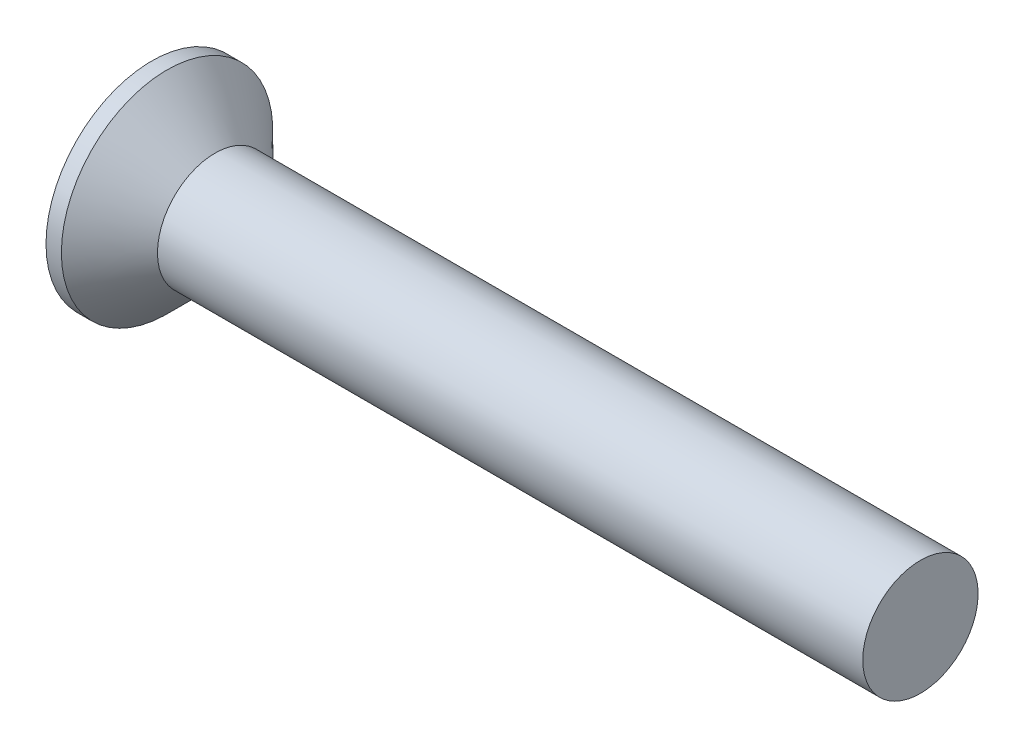
ISO-10303-21;
HEADER;
FILE_DESCRIPTION(('STEP AP214'),'2;1');
FILE_NAME('part.step','',(''),(''),'','','');
FILE_SCHEMA(('AUTOMOTIVE_DESIGN { 1 0 10303 214 1 1 1 1 }'));
ENDSEC;
DATA;
#1=APPLICATION_CONTEXT('core data for automotive mechanical design processes');
#2=APPLICATION_PROTOCOL_DEFINITION('international standard','automotive_design',2000,#1);
#3=PRODUCT_CONTEXT('',#1,'mechanical');
#4=PRODUCT('Part','Part','',(#3));
#5=PRODUCT_RELATED_PRODUCT_CATEGORY('part','',(#4));
#6=PRODUCT_DEFINITION_FORMATION('','',#4);
#7=PRODUCT_DEFINITION_CONTEXT('part definition',#1,'design');
#8=PRODUCT_DEFINITION('design','',#6,#7);
#9=PRODUCT_DEFINITION_SHAPE('','',#8);
#10=(LENGTH_UNIT() NAMED_UNIT(*) SI_UNIT(.MILLI.,.METRE.));
#11=(NAMED_UNIT(*) PLANE_ANGLE_UNIT() SI_UNIT($,.RADIAN.));
#12=(NAMED_UNIT(*) SI_UNIT($,.STERADIAN.) SOLID_ANGLE_UNIT());
#13=UNCERTAINTY_MEASURE_WITH_UNIT(LENGTH_MEASURE(1.E-05),#10,'distance_accuracy_value','');
#14=(GEOMETRIC_REPRESENTATION_CONTEXT(3) GLOBAL_UNCERTAINTY_ASSIGNED_CONTEXT((#13)) GLOBAL_UNIT_ASSIGNED_CONTEXT((#10,
#11,#12)) REPRESENTATION_CONTEXT('',''));
#15=CARTESIAN_POINT('',(0.,0.,0.));
#16=DIRECTION('',(0.,0.,1.));
#17=DIRECTION('',(1.,0.,0.));
#18=AXIS2_PLACEMENT_3D('',#15,#16,#17);
#19=CARTESIAN_POINT('',(0.,2.75,0.));
#20=DIRECTION('',(1.,0.,0.));
#21=DIRECTION('',(0.,0.,-1.));
#22=AXIS2_PLACEMENT_3D('',#19,#20,#21);
#23=PLANE('',#22);
#24=CARTESIAN_POINT('',(0.,0.,0.));
#25=DIRECTION('',(-1.,0.,0.));
#26=DIRECTION('',(0.,0.,1.));
#27=AXIS2_PLACEMENT_3D('',#24,#25,#26);
#28=CIRCLE('',#27,2.75);
#29=CARTESIAN_POINT('',(0.,0.,2.75));
#30=VERTEX_POINT('',#29);
#31=EDGE_CURVE('E44',#30,#30,#28,.T.);
#32=ORIENTED_EDGE('',*,*,#31,.T.);
#33=EDGE_LOOP('',(#32));
#34=FACE_BOUND('',#33,.T.);
#35=ADVANCED_FACE('F30',(#34),#23,.F.);
#36=CARTESIAN_POINT('',(20.,0.,0.));
#37=DIRECTION('',(-1.,0.,0.));
#38=DIRECTION('',(0.,0.,1.));
#39=AXIS2_PLACEMENT_3D('',#36,#37,#38);
#40=PLANE('',#39);
#41=CARTESIAN_POINT('',(20.,0.,0.));
#42=DIRECTION('',(-1.,0.,0.));
#43=DIRECTION('',(0.,0.,1.));
#44=AXIS2_PLACEMENT_3D('',#41,#42,#43);
#45=CIRCLE('',#44,1.5);
#46=CARTESIAN_POINT('',(20.,0.,1.5));
#47=VERTEX_POINT('',#46);
#48=EDGE_CURVE('E10',#47,#47,#45,.T.);
#49=ORIENTED_EDGE('',*,*,#48,.F.);
#50=EDGE_LOOP('',(#49));
#51=FACE_BOUND('',#50,.T.);
#52=ADVANCED_FACE('F64',(#51),#40,.F.);
#53=CARTESIAN_POINT('',(0.,0.,0.));
#54=DIRECTION('',(-1.,0.,0.));
#55=DIRECTION('',(0.,0.,1.));
#56=AXIS2_PLACEMENT_3D('',#53,#54,#55);
#57=CYLINDRICAL_SURFACE('',#56,1.5);
#58=CARTESIAN_POINT('',(1.65,0.,0.));
#59=DIRECTION('',(-1.,0.,0.));
#60=DIRECTION('',(0.,0.,1.));
#61=AXIS2_PLACEMENT_3D('',#58,#59,#60);
#62=CIRCLE('',#61,1.5);
#63=CARTESIAN_POINT('',(1.65,0.,1.5));
#64=VERTEX_POINT('',#63);
#65=EDGE_CURVE('E36',#64,#64,#62,.T.);
#66=ORIENTED_EDGE('',*,*,#65,.F.);
#67=EDGE_LOOP('',(#66));
#68=FACE_BOUND('',#67,.T.);
#69=ORIENTED_EDGE('',*,*,#48,.T.);
#70=EDGE_LOOP('',(#69));
#71=FACE_BOUND('',#70,.T.);
#72=ADVANCED_FACE('F59',(#68,#71),#57,.T.);
#73=CARTESIAN_POINT('',(1.65,0.,0.));
#74=DIRECTION('',(-1.,0.,0.));
#75=DIRECTION('',(0.,0.,1.));
#76=AXIS2_PLACEMENT_3D('',#73,#74,#75);
#77=CONICAL_SURFACE('',#76,1.5,0.78539816339745);
#78=CARTESIAN_POINT('',(0.400000000000003,0.,0.));
#79=DIRECTION('',(-1.,0.,0.));
#80=DIRECTION('',(0.,0.,1.));
#81=AXIS2_PLACEMENT_3D('',#78,#79,#80);
#82=CIRCLE('',#81,2.75);
#83=CARTESIAN_POINT('',(0.400000000000003,0.,2.75));
#84=VERTEX_POINT('',#83);
#85=EDGE_CURVE('E40',#84,#84,#82,.T.);
#86=ORIENTED_EDGE('',*,*,#85,.F.);
#87=EDGE_LOOP('',(#86));
#88=FACE_BOUND('',#87,.T.);
#89=ORIENTED_EDGE('',*,*,#65,.T.);
#90=EDGE_LOOP('',(#89));
#91=FACE_BOUND('',#90,.T.);
#92=ADVANCED_FACE('F54',(#88,#91),#77,.T.);
#93=CARTESIAN_POINT('',(0.,0.,0.));
#94=DIRECTION('',(-1.,0.,0.));
#95=DIRECTION('',(0.,0.,1.));
#96=AXIS2_PLACEMENT_3D('',#93,#94,#95);
#97=CYLINDRICAL_SURFACE('',#96,2.75);
#98=ORIENTED_EDGE('',*,*,#31,.F.);
#99=EDGE_LOOP('',(#98));
#100=FACE_BOUND('',#99,.T.);
#101=ORIENTED_EDGE('',*,*,#85,.T.);
#102=EDGE_LOOP('',(#101));
#103=FACE_BOUND('',#102,.T.);
#104=ADVANCED_FACE('F51',(#100,#103),#97,.T.);
#105=CLOSED_SHELL('',(#35,#52,#72,#92,#104));
#106=MANIFOLD_SOLID_BREP('B2',#105);
#107=ADVANCED_BREP_SHAPE_REPRESENTATION('',(#18,#106),#14);
#108=SHAPE_DEFINITION_REPRESENTATION(#9,#107);
ENDSEC;
END-ISO-10303-21;
